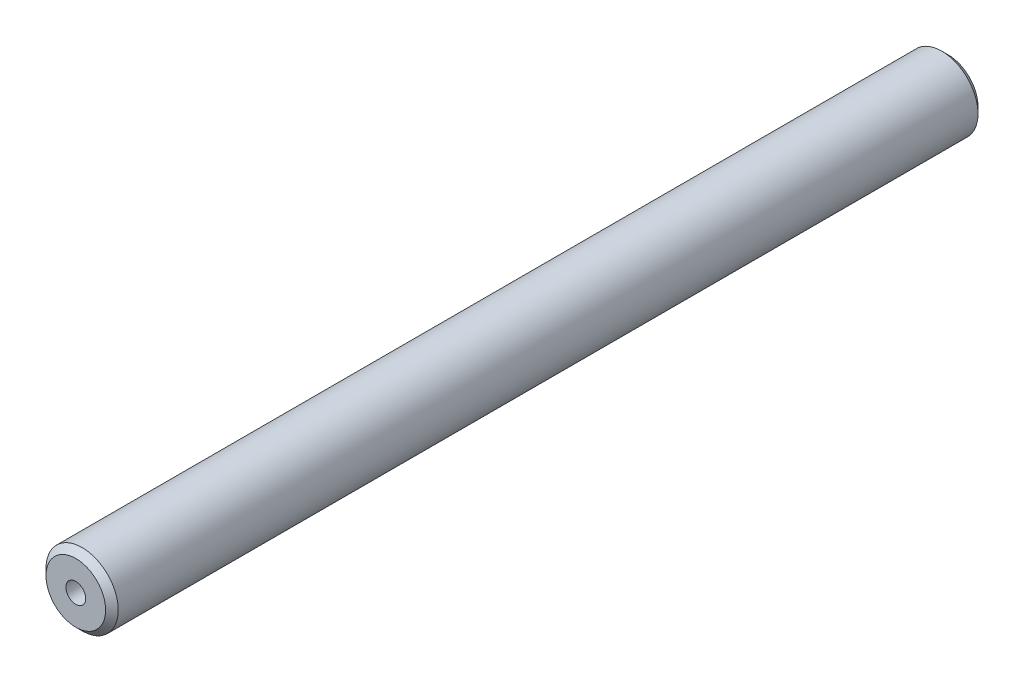
ISO-10303-21;
HEADER;
FILE_DESCRIPTION(('STEP AP214'),'2;1');
FILE_NAME('part.step','',(''),(''),'','','');
FILE_SCHEMA(('AUTOMOTIVE_DESIGN { 1 0 10303 214 1 1 1 1 }'));
ENDSEC;
DATA;
#1=APPLICATION_CONTEXT('core data for automotive mechanical design processes');
#2=APPLICATION_PROTOCOL_DEFINITION('international standard','automotive_design',2000,#1);
#3=PRODUCT_CONTEXT('',#1,'mechanical');
#4=PRODUCT('Part','Part','',(#3));
#5=PRODUCT_RELATED_PRODUCT_CATEGORY('part','',(#4));
#6=PRODUCT_DEFINITION_FORMATION('','',#4);
#7=PRODUCT_DEFINITION_CONTEXT('part definition',#1,'design');
#8=PRODUCT_DEFINITION('design','',#6,#7);
#9=PRODUCT_DEFINITION_SHAPE('','',#8);
#10=(LENGTH_UNIT() NAMED_UNIT(*) SI_UNIT(.MILLI.,.METRE.));
#11=(NAMED_UNIT(*) PLANE_ANGLE_UNIT() SI_UNIT($,.RADIAN.));
#12=(NAMED_UNIT(*) SI_UNIT($,.STERADIAN.) SOLID_ANGLE_UNIT());
#13=UNCERTAINTY_MEASURE_WITH_UNIT(LENGTH_MEASURE(1.E-05),#10,'distance_accuracy_value','');
#14=(GEOMETRIC_REPRESENTATION_CONTEXT(3) GLOBAL_UNCERTAINTY_ASSIGNED_CONTEXT((#13)) GLOBAL_UNIT_ASSIGNED_CONTEXT((#10,
#11,#12)) REPRESENTATION_CONTEXT('',''));
#15=CARTESIAN_POINT('',(0.,0.,0.));
#16=DIRECTION('',(0.,0.,1.));
#17=DIRECTION('',(1.,0.,0.));
#18=AXIS2_PLACEMENT_3D('',#15,#16,#17);
#19=CARTESIAN_POINT('',(0.,0.,96.6));
#20=DIRECTION('',(0.,0.,-1.));
#21=DIRECTION('',(-1.,0.,0.));
#22=AXIS2_PLACEMENT_3D('',#19,#20,#21);
#23=CYLINDRICAL_SURFACE('',#22,4.);
#24=CARTESIAN_POINT('',(0.,0.,0.700000000000062));
#25=DIRECTION('',(0.,0.,1.));
#26=DIRECTION('',(1.,0.,0.));
#27=AXIS2_PLACEMENT_3D('',#24,#25,#26);
#28=CIRCLE('',#27,4.);
#29=CARTESIAN_POINT('',(-4.,0.,0.700000000000048));
#30=VERTEX_POINT('',#29);
#31=EDGE_CURVE('E38',#30,#30,#28,.T.);
#32=CARTESIAN_POINT('',(0.,0.,95.9));
#33=DIRECTION('',(0.,0.,1.));
#34=DIRECTION('',(1.,0.,0.));
#35=AXIS2_PLACEMENT_3D('',#32,#33,#34);
#36=CIRCLE('',#35,4.);
#37=CARTESIAN_POINT('',(-4.,0.,95.9));
#38=VERTEX_POINT('',#37);
#39=EDGE_CURVE('E42',#38,#38,#36,.F.);
#40=CARTESIAN_POINT('',(-4.,0.,0.700000000000048));
#41=CARTESIAN_POINT('',(-4.,0.,1.69166666666672));
#42=CARTESIAN_POINT('',(-4.,0.,2.68333333333338));
#43=CARTESIAN_POINT('',(-4.,0.,4.66666666666672));
#44=CARTESIAN_POINT('',(-4.,0.,5.65833333333338));
#45=CARTESIAN_POINT('',(-4.,0.,7.64166666666671));
#46=CARTESIAN_POINT('',(-4.,0.,8.63333333333338));
#47=CARTESIAN_POINT('',(-4.,0.,10.6166666666667));
#48=CARTESIAN_POINT('',(-4.,0.,11.6083333333334));
#49=CARTESIAN_POINT('',(-4.,0.,13.5916666666667));
#50=CARTESIAN_POINT('',(-4.,0.,14.5833333333334));
#51=CARTESIAN_POINT('',(-4.,0.,16.5666666666667));
#52=CARTESIAN_POINT('',(-4.,0.,17.5583333333334));
#53=CARTESIAN_POINT('',(-4.,0.,19.5416666666667));
#54=CARTESIAN_POINT('',(-4.,0.,20.5333333333334));
#55=CARTESIAN_POINT('',(-4.,0.,22.5166666666667));
#56=CARTESIAN_POINT('',(-4.,0.,23.5083333333334));
#57=CARTESIAN_POINT('',(-4.,0.,25.4916666666667));
#58=CARTESIAN_POINT('',(-4.,0.,26.4833333333334));
#59=CARTESIAN_POINT('',(-4.,0.,28.4666666666667));
#60=CARTESIAN_POINT('',(-4.,0.,29.4583333333334));
#61=CARTESIAN_POINT('',(-4.,0.,31.4416666666667));
#62=CARTESIAN_POINT('',(-4.,0.,32.4333333333334));
#63=CARTESIAN_POINT('',(-4.,0.,34.4166666666667));
#64=CARTESIAN_POINT('',(-4.,0.,35.4083333333334));
#65=CARTESIAN_POINT('',(-4.,0.,37.3916666666667));
#66=CARTESIAN_POINT('',(-4.,0.,38.3833333333334));
#67=CARTESIAN_POINT('',(-4.,0.,40.3666666666667));
#68=CARTESIAN_POINT('',(-4.,0.,41.3583333333334));
#69=CARTESIAN_POINT('',(-4.,0.,43.3416666666667));
#70=CARTESIAN_POINT('',(-4.,0.,44.3333333333334));
#71=CARTESIAN_POINT('',(-4.,0.,46.3166666666667));
#72=CARTESIAN_POINT('',(-4.,0.,47.3083333333334));
#73=CARTESIAN_POINT('',(-4.,0.,49.2916666666667));
#74=CARTESIAN_POINT('',(-4.,0.,50.2833333333334));
#75=CARTESIAN_POINT('',(-4.,0.,52.2666666666667));
#76=CARTESIAN_POINT('',(-4.,0.,53.2583333333334));
#77=CARTESIAN_POINT('',(-4.,0.,55.2416666666667));
#78=CARTESIAN_POINT('',(-4.,0.,56.2333333333334));
#79=CARTESIAN_POINT('',(-4.,0.,58.2166666666667));
#80=CARTESIAN_POINT('',(-4.,0.,59.2083333333334));
#81=CARTESIAN_POINT('',(-4.,0.,61.1916666666667));
#82=CARTESIAN_POINT('',(-4.,0.,62.1833333333334));
#83=CARTESIAN_POINT('',(-4.,0.,64.1666666666667));
#84=CARTESIAN_POINT('',(-4.,0.,65.1583333333334));
#85=CARTESIAN_POINT('',(-4.,0.,67.1416666666667));
#86=CARTESIAN_POINT('',(-4.,0.,68.1333333333334));
#87=CARTESIAN_POINT('',(-4.,0.,70.1166666666667));
#88=CARTESIAN_POINT('',(-4.,0.,71.1083333333334));
#89=CARTESIAN_POINT('',(-4.,0.,73.0916666666667));
#90=CARTESIAN_POINT('',(-4.,0.,74.0833333333334));
#91=CARTESIAN_POINT('',(-4.,0.,76.0666666666667));
#92=CARTESIAN_POINT('',(-4.,0.,77.0583333333334));
#93=CARTESIAN_POINT('',(-4.,0.,79.0416666666667));
#94=CARTESIAN_POINT('',(-4.,0.,80.0333333333334));
#95=CARTESIAN_POINT('',(-4.,0.,82.0166666666667));
#96=CARTESIAN_POINT('',(-4.,0.,83.0083333333334));
#97=CARTESIAN_POINT('',(-4.,0.,84.9916666666667));
#98=CARTESIAN_POINT('',(-4.,0.,85.9833333333334));
#99=CARTESIAN_POINT('',(-4.,0.,87.9666666666667));
#100=CARTESIAN_POINT('',(-4.,0.,88.9583333333334));
#101=CARTESIAN_POINT('',(-4.,0.,90.9416666666667));
#102=CARTESIAN_POINT('',(-4.,0.,91.9333333333334));
#103=CARTESIAN_POINT('',(-4.,0.,93.9166666666667));
#104=CARTESIAN_POINT('',(-4.,0.,94.9083333333334));
#105=CARTESIAN_POINT('',(-4.,0.,95.9));
#106=B_SPLINE_CURVE_WITH_KNOTS('',3,(#40,#41,#42,#43,#44,#45,#46,#47,#48,#49,#50,#51,#52,#53,
#54,#55,#56,#57,#58,#59,#60,#61,#62,#63,#64,#65,#66,#67,#68,#69,#70,#71,#72,#73,#74,#75,#76,#77,
#78,#79,#80,#81,#82,#83,#84,#85,#86,#87,#88,#89,#90,#91,#92,#93,#94,#95,#96,#97,#98,#99,#100,
#101,#102,#103,#104,#105),.UNSPECIFIED.,.F.,.F.,(4,2,2,2,2,2,2,2,2,2,2,2,2,2,2,2,2,2,2,2,2,2,2,
2,2,2,2,2,2,2,2,2,4),(0.,2.97500000000001,5.95,8.925,11.9,14.875,17.85,20.825,23.8,26.775,29.75,
32.725,35.7,38.675,41.65,44.625,47.6,50.575,53.55,56.525,59.5,62.475,65.45,68.425,71.4,74.375,
77.35,80.325,83.3,86.275,89.25,92.225,95.2),.UNSPECIFIED.);
#107=EDGE_CURVE('BSEAM31',#30,#38,#106,.T.);
#108=ORIENTED_EDGE('',*,*,#31,.T.);
#109=ORIENTED_EDGE('',*,*,#39,.T.);
#110=ORIENTED_EDGE('',*,*,#107,.T.);
#111=ORIENTED_EDGE('',*,*,#107,.F.);
#112=EDGE_LOOP('',(#108,#110,#109,#111));
#113=FACE_BOUND('',#112,.T.);
#114=ADVANCED_FACE('F31',(#113),#23,.T.);
#115=CARTESIAN_POINT('',(0.,0.,96.6));
#116=DIRECTION('',(0.,0.,1.));
#117=DIRECTION('',(1.,0.,0.));
#118=AXIS2_PLACEMENT_3D('',#115,#116,#117);
#119=PLANE('',#118);
#120=CARTESIAN_POINT('',(0.,0.,96.6));
#121=DIRECTION('',(0.,0.,1.));
#122=DIRECTION('',(1.,0.,0.));
#123=AXIS2_PLACEMENT_3D('',#120,#121,#122);
#124=CIRCLE('',#123,3.30000000000004);
#125=CARTESIAN_POINT('',(-3.30000000000005,0.,96.6));
#126=VERTEX_POINT('',#125);
#127=EDGE_CURVE('E46',#126,#126,#124,.T.);
#128=ORIENTED_EDGE('',*,*,#127,.T.);
#129=EDGE_LOOP('',(#128));
#130=FACE_BOUND('',#129,.T.);
#131=CARTESIAN_POINT('',(0.,0.,96.6));
#132=DIRECTION('',(0.,0.,1.));
#133=DIRECTION('',(1.,0.,0.));
#134=AXIS2_PLACEMENT_3D('',#131,#132,#133);
#135=CIRCLE('',#134,1.1);
#136=CARTESIAN_POINT('',(1.1,0.,96.6));
#137=VERTEX_POINT('',#136);
#138=EDGE_CURVE('E52',#137,#137,#135,.T.);
#139=ORIENTED_EDGE('',*,*,#138,.F.);
#140=EDGE_LOOP('',(#139));
#141=FACE_BOUND('',#140,.T.);
#142=ADVANCED_FACE('F67',(#130,#141),#119,.T.);
#143=CARTESIAN_POINT('',(0.,0.,0.));
#144=DIRECTION('',(0.,0.,1.));
#145=DIRECTION('',(1.,0.,0.));
#146=AXIS2_PLACEMENT_3D('',#143,#144,#145);
#147=PLANE('',#146);
#148=CARTESIAN_POINT('',(0.,0.,0.));
#149=DIRECTION('',(0.,0.,1.));
#150=DIRECTION('',(1.,0.,0.));
#151=AXIS2_PLACEMENT_3D('',#148,#149,#150);
#152=CIRCLE('',#151,3.29999999999994);
#153=CARTESIAN_POINT('',(3.29999999999994,0.,0.));
#154=VERTEX_POINT('',#153);
#155=EDGE_CURVE('E10',#154,#154,#152,.F.);
#156=ORIENTED_EDGE('',*,*,#155,.T.);
#157=EDGE_LOOP('',(#156));
#158=FACE_BOUND('',#157,.T.);
#159=ADVANCED_FACE('F63',(#158),#147,.F.);
#160=CARTESIAN_POINT('',(0.,0.,71.6));
#161=DIRECTION('',(0.,0.,1.));
#162=DIRECTION('',(1.,0.,0.));
#163=AXIS2_PLACEMENT_3D('',#160,#161,#162);
#164=CYLINDRICAL_SURFACE('',#163,1.1);
#165=CARTESIAN_POINT('',(0.,0.,71.6));
#166=DIRECTION('',(0.,0.,1.));
#167=DIRECTION('',(1.,0.,0.));
#168=AXIS2_PLACEMENT_3D('',#165,#166,#167);
#169=CIRCLE('',#168,1.1);
#170=CARTESIAN_POINT('',(1.1,0.,71.6));
#171=VERTEX_POINT('',#170);
#172=EDGE_CURVE('E51',#171,#171,#169,.T.);
#173=ORIENTED_EDGE('',*,*,#172,.F.);
#174=EDGE_LOOP('',(#173));
#175=FACE_BOUND('',#174,.T.);
#176=ORIENTED_EDGE('',*,*,#138,.T.);
#177=EDGE_LOOP('',(#176));
#178=FACE_BOUND('',#177,.T.);
#179=ADVANCED_FACE('F60',(#175,#178),#164,.F.);
#180=CARTESIAN_POINT('',(0.,0.,71.6));
#181=DIRECTION('',(0.,0.,1.));
#182=DIRECTION('',(1.,0.,0.));
#183=AXIS2_PLACEMENT_3D('',#180,#181,#182);
#184=PLANE('',#183);
#185=ORIENTED_EDGE('',*,*,#172,.T.);
#186=EDGE_LOOP('',(#185));
#187=FACE_BOUND('',#186,.T.);
#188=ADVANCED_FACE('F58',(#187),#184,.T.);
#189=CARTESIAN_POINT('',(0.,0.,96.6));
#190=DIRECTION('',(0.,0.,-1.));
#191=DIRECTION('',(-1.,0.,0.));
#192=AXIS2_PLACEMENT_3D('',#189,#190,#191);
#193=CONICAL_SURFACE('',#192,3.30000000000004,0.785398163397456);
#194=CARTESIAN_POINT('',(-4.00000000000001,0.,95.9));
#195=CARTESIAN_POINT('',(-3.99270833333334,0.,95.9072916666667));
#196=CARTESIAN_POINT('',(-3.98541666666667,0.,95.9145833333334));
#197=CARTESIAN_POINT('',(-3.97083333333334,0.,95.9291666666667));
#198=CARTESIAN_POINT('',(-3.96354166666668,0.,95.9364583333334));
#199=CARTESIAN_POINT('',(-3.94895833333334,0.,95.9510416666667));
#200=CARTESIAN_POINT('',(-3.94166666666668,0.,95.9583333333334));
#201=CARTESIAN_POINT('',(-3.92708333333334,0.,95.9729166666667));
#202=CARTESIAN_POINT('',(-3.91979166666668,0.,95.9802083333334));
#203=CARTESIAN_POINT('',(-3.90520833333335,0.,95.9947916666667));
#204=CARTESIAN_POINT('',(-3.89791666666668,0.,96.0020833333334));
#205=CARTESIAN_POINT('',(-3.88333333333335,0.,96.0166666666667));
#206=CARTESIAN_POINT('',(-3.87604166666668,0.,96.0239583333334));
#207=CARTESIAN_POINT('',(-3.86145833333335,0.,96.0385416666667));
#208=CARTESIAN_POINT('',(-3.85416666666668,0.,96.0458333333334));
#209=CARTESIAN_POINT('',(-3.83958333333335,0.,96.0604166666667));
#210=CARTESIAN_POINT('',(-3.83229166666668,0.,96.0677083333333));
#211=CARTESIAN_POINT('',(-3.81770833333335,0.,96.0822916666667));
#212=CARTESIAN_POINT('',(-3.81041666666669,0.,96.0895833333334));
#213=CARTESIAN_POINT('',(-3.79583333333335,0.,96.1041666666667));
#214=CARTESIAN_POINT('',(-3.78854166666668,0.,96.1114583333334));
#215=CARTESIAN_POINT('',(-3.77395833333335,0.,96.1260416666667));
#216=CARTESIAN_POINT('',(-3.76666666666669,0.,96.1333333333334));
#217=CARTESIAN_POINT('',(-3.75208333333335,0.,96.1479166666667));
#218=CARTESIAN_POINT('',(-3.74479166666669,0.,96.1552083333333));
#219=CARTESIAN_POINT('',(-3.73020833333335,0.,96.1697916666667));
#220=CARTESIAN_POINT('',(-3.72291666666669,0.,96.1770833333333));
#221=CARTESIAN_POINT('',(-3.70833333333336,0.,96.1916666666667));
#222=CARTESIAN_POINT('',(-3.70104166666669,0.,96.1989583333334));
#223=CARTESIAN_POINT('',(-3.68645833333336,0.,96.2135416666667));
#224=CARTESIAN_POINT('',(-3.67916666666669,0.,96.2208333333333));
#225=CARTESIAN_POINT('',(-3.66458333333336,0.,96.2354166666667));
#226=CARTESIAN_POINT('',(-3.65729166666669,0.,96.2427083333333));
#227=CARTESIAN_POINT('',(-3.64270833333336,0.,96.2572916666667));
#228=CARTESIAN_POINT('',(-3.63541666666669,0.,96.2645833333333));
#229=CARTESIAN_POINT('',(-3.62083333333336,0.,96.2791666666667));
#230=CARTESIAN_POINT('',(-3.6135416666667,0.,96.2864583333333));
#231=CARTESIAN_POINT('',(-3.59895833333336,0.,96.3010416666667));
#232=CARTESIAN_POINT('',(-3.59166666666669,0.,96.3083333333333));
#233=CARTESIAN_POINT('',(-3.57708333333336,0.,96.3229166666667));
#234=CARTESIAN_POINT('',(-3.5697916666667,0.,96.3302083333333));
#235=CARTESIAN_POINT('',(-3.55520833333337,0.,96.3447916666667));
#236=CARTESIAN_POINT('',(-3.5479166666667,0.,96.3520833333333));
#237=CARTESIAN_POINT('',(-3.53333333333336,0.,96.3666666666667));
#238=CARTESIAN_POINT('',(-3.5260416666667,0.,96.3739583333333));
#239=CARTESIAN_POINT('',(-3.51145833333337,0.,96.3885416666667));
#240=CARTESIAN_POINT('',(-3.5041666666667,0.,96.3958333333333));
#241=CARTESIAN_POINT('',(-3.48958333333337,0.,96.4104166666667));
#242=CARTESIAN_POINT('',(-3.4822916666667,0.,96.4177083333333));
#243=CARTESIAN_POINT('',(-3.46770833333337,0.,96.4322916666667));
#244=CARTESIAN_POINT('',(-3.4604166666667,0.,96.4395833333333));
#245=CARTESIAN_POINT('',(-3.44583333333337,0.,96.4541666666667));
#246=CARTESIAN_POINT('',(-3.4385416666667,0.,96.4614583333333));
#247=CARTESIAN_POINT('',(-3.42395833333337,0.,96.4760416666667));
#248=CARTESIAN_POINT('',(-3.41666666666671,0.,96.4833333333333));
#249=CARTESIAN_POINT('',(-3.40208333333337,0.,96.4979166666667));
#250=CARTESIAN_POINT('',(-3.39479166666671,0.,96.5052083333333));
#251=CARTESIAN_POINT('',(-3.38020833333337,0.,96.5197916666667));
#252=CARTESIAN_POINT('',(-3.37291666666671,0.,96.5270833333333));
#253=CARTESIAN_POINT('',(-3.35833333333338,0.,96.5416666666667));
#254=CARTESIAN_POINT('',(-3.35104166666671,0.,96.5489583333333));
#255=CARTESIAN_POINT('',(-3.33645833333338,0.,96.5635416666667));
#256=CARTESIAN_POINT('',(-3.32916666666671,0.,96.5708333333333));
#257=CARTESIAN_POINT('',(-3.31458333333338,0.,96.5854166666667));
#258=CARTESIAN_POINT('',(-3.30729166666671,0.,96.5927083333333));
#259=CARTESIAN_POINT('',(-3.30000000000005,0.,96.6));
#260=B_SPLINE_CURVE_WITH_KNOTS('',3,(#194,#195,#196,#197,#198,#199,#200,#201,#202,#203,#204,
#205,#206,#207,#208,#209,#210,#211,#212,#213,#214,#215,#216,#217,#218,#219,#220,#221,#222,#223,
#224,#225,#226,#227,#228,#229,#230,#231,#232,#233,#234,#235,#236,#237,#238,#239,#240,#241,#242,
#243,#244,#245,#246,#247,#248,#249,#250,#251,#252,#253,#254,#255,#256,#257,#258,#259),
.UNSPECIFIED.,.F.,.F.,(4,2,2,2,2,2,2,2,2,2,2,2,2,2,2,2,2,2,2,2,2,2,2,2,2,2,2,2,2,2,2,2,4),(0.,
0.0309359216769136,0.0618718433538271,0.0928077650307315,0.123743686707645,0.154679608384549,
0.185615530061463,0.216551451738367,0.247487373415281,0.278423295092195,0.309359216769099,
0.340295138446013,0.371231060122917,0.40216698179983,0.433102903476734,0.464038825153648,
0.494974746830552,0.525910668507466,0.55684659018438,0.587782511861284,0.618718433538198,
0.649654355215102,0.680590276892016,0.711526198568919,0.742462120245833,0.773398041922747,
0.804333963599651,0.835269885276565,0.866205806953469,0.897141728630383,0.928077650307287,
0.959013571984201,0.989949493661115),.UNSPECIFIED.);
#261=EDGE_CURVE('BSEAM78',#38,#126,#260,.T.);
#262=ORIENTED_EDGE('',*,*,#39,.F.);
#263=ORIENTED_EDGE('',*,*,#127,.F.);
#264=ORIENTED_EDGE('',*,*,#261,.T.);
#265=ORIENTED_EDGE('',*,*,#261,.F.);
#266=EDGE_LOOP('',(#262,#264,#263,#265));
#267=FACE_BOUND('',#266,.T.);
#268=ADVANCED_FACE('F78',(#267),#193,.T.);
#269=CARTESIAN_POINT('',(0.,0.,0.700000000000062));
#270=DIRECTION('',(0.,0.,1.));
#271=DIRECTION('',(1.,0.,0.));
#272=AXIS2_PLACEMENT_3D('',#269,#270,#271);
#273=CONICAL_SURFACE('',#272,4.,0.785398163397446);
#274=ORIENTED_EDGE('',*,*,#155,.F.);
#275=EDGE_LOOP('',(#274));
#276=FACE_BOUND('',#275,.T.);
#277=ORIENTED_EDGE('',*,*,#31,.F.);
#278=EDGE_LOOP('',(#277));
#279=FACE_BOUND('',#278,.T.);
#280=ADVANCED_FACE('F33',(#276,#279),#273,.T.);
#281=CLOSED_SHELL('',(#114,#142,#159,#179,#188,#268,#280));
#282=MANIFOLD_SOLID_BREP('B2',#281);
#283=ADVANCED_BREP_SHAPE_REPRESENTATION('',(#18,#282),#14);
#284=SHAPE_DEFINITION_REPRESENTATION(#9,#283);
ENDSEC;
END-ISO-10303-21;
